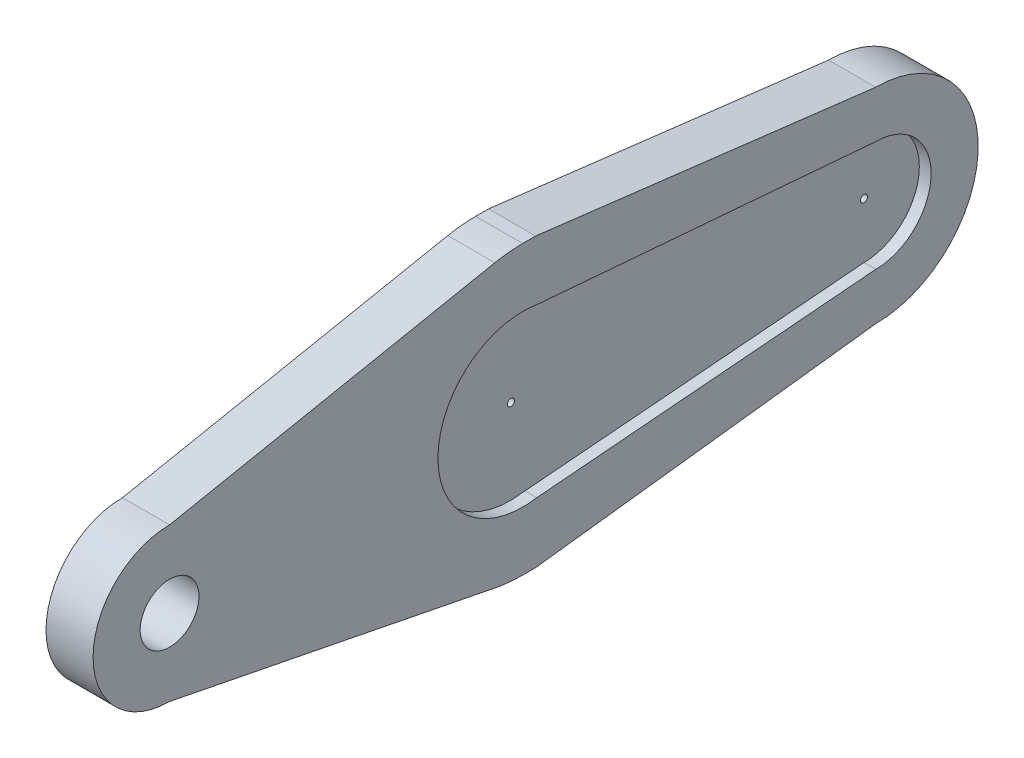
ISO-10303-21;
HEADER;
FILE_DESCRIPTION(('STEP AP214'),'2;1');
FILE_NAME('part.step','',(''),(''),'','','');
FILE_SCHEMA(('AUTOMOTIVE_DESIGN { 1 0 10303 214 1 1 1 1 }'));
ENDSEC;
DATA;
#1=APPLICATION_CONTEXT('core data for automotive mechanical design processes');
#2=APPLICATION_PROTOCOL_DEFINITION('international standard','automotive_design',2000,#1);
#3=PRODUCT_CONTEXT('',#1,'mechanical');
#4=PRODUCT('Part','Part','',(#3));
#5=PRODUCT_RELATED_PRODUCT_CATEGORY('part','',(#4));
#6=PRODUCT_DEFINITION_FORMATION('','',#4);
#7=PRODUCT_DEFINITION_CONTEXT('part definition',#1,'design');
#8=PRODUCT_DEFINITION('design','',#6,#7);
#9=PRODUCT_DEFINITION_SHAPE('','',#8);
#10=(LENGTH_UNIT() NAMED_UNIT(*) SI_UNIT(.MILLI.,.METRE.));
#11=(NAMED_UNIT(*) PLANE_ANGLE_UNIT() SI_UNIT($,.RADIAN.));
#12=(NAMED_UNIT(*) SI_UNIT($,.STERADIAN.) SOLID_ANGLE_UNIT());
#13=UNCERTAINTY_MEASURE_WITH_UNIT(LENGTH_MEASURE(1.E-05),#10,'distance_accuracy_value','');
#14=(GEOMETRIC_REPRESENTATION_CONTEXT(3) GLOBAL_UNCERTAINTY_ASSIGNED_CONTEXT((#13)) GLOBAL_UNIT_ASSIGNED_CONTEXT((#10,
#11,#12)) REPRESENTATION_CONTEXT('',''));
#15=CARTESIAN_POINT('',(0.,0.,0.));
#16=DIRECTION('',(0.,0.,1.));
#17=DIRECTION('',(1.,0.,0.));
#18=AXIS2_PLACEMENT_3D('',#15,#16,#17);
#19=CARTESIAN_POINT('',(2.,0.,0.549999999999999));
#20=DIRECTION('',(-1.,0.,0.));
#21=DIRECTION('',(0.,0.,1.));
#22=AXIS2_PLACEMENT_3D('',#19,#20,#21);
#23=CYLINDRICAL_SURFACE('',#22,3.6);
#24=CARTESIAN_POINT('',(0.,0.,0.549999999999999));
#25=DIRECTION('',(1.,0.,0.));
#26=DIRECTION('',(0.,0.,-1.));
#27=AXIS2_PLACEMENT_3D('',#24,#25,#26);
#28=CIRCLE('',#27,3.6);
#29=CARTESIAN_POINT('',(0.,-3.6,0.549999999999999));
#30=VERTEX_POINT('',#29);
#31=CARTESIAN_POINT('',(0.,-3.55034482758621,-0.0458620689654945));
#32=VERTEX_POINT('',#31);
#33=EDGE_CURVE('E193',#30,#32,#28,.T.);
#34=ORIENTED_EDGE('',*,*,#33,.F.);
#35=DIRECTION('',(-1.,0.,0.));
#36=VECTOR('',#35,1.);
#37=CARTESIAN_POINT('',(1.5,-3.6,0.549999999999999));
#38=LINE('',#37,#36);
#39=CARTESIAN_POINT('',(1.5,-3.6,0.549999999999999));
#40=VERTEX_POINT('',#39);
#41=EDGE_CURVE('E328',#40,#30,#38,.T.);
#42=ORIENTED_EDGE('',*,*,#41,.F.);
#43=CARTESIAN_POINT('',(1.5,0.,0.549999999999999));
#44=DIRECTION('',(1.,0.,0.));
#45=DIRECTION('',(0.,0.,-1.));
#46=AXIS2_PLACEMENT_3D('',#43,#44,#45);
#47=CIRCLE('',#46,3.6);
#48=CARTESIAN_POINT('',(1.5,3.6,0.549999999999999));
#49=VERTEX_POINT('',#48);
#50=EDGE_CURVE('E309',#49,#40,#47,.T.);
#51=ORIENTED_EDGE('',*,*,#50,.F.);
#52=DIRECTION('',(-1.,0.,0.));
#53=VECTOR('',#52,1.);
#54=CARTESIAN_POINT('',(1.5,3.6,0.549999999999999));
#55=LINE('',#54,#53);
#56=CARTESIAN_POINT('',(0.,3.6,0.549999999999999));
#57=VERTEX_POINT('',#56);
#58=EDGE_CURVE('E336',#49,#57,#55,.T.);
#59=ORIENTED_EDGE('',*,*,#58,.T.);
#60=CARTESIAN_POINT('',(0.,3.55034482758621,-0.0458620689654861));
#61=VERTEX_POINT('',#60);
#62=EDGE_CURVE('E195',#61,#57,#28,.T.);
#63=ORIENTED_EDGE('',*,*,#62,.F.);
#64=DIRECTION('',(-1.,0.,0.));
#65=VECTOR('',#64,1.);
#66=CARTESIAN_POINT('',(2.,3.55034482758621,-0.0458620689655113));
#67=LINE('',#66,#65);
#68=CARTESIAN_POINT('',(1.5,3.55034482758621,-0.0458620689654861));
#69=VERTEX_POINT('',#68);
#70=EDGE_CURVE('E305',#61,#69,#67,.F.);
#71=ORIENTED_EDGE('',*,*,#70,.T.);
#72=DIRECTION('',(-1.,0.,0.));
#73=VECTOR('',#72,1.);
#74=CARTESIAN_POINT('',(2.,3.55034482758621,-0.0458620689654861));
#75=LINE('',#74,#73);
#76=CARTESIAN_POINT('',(2.,3.55034482758621,-0.0458620689654861));
#77=VERTEX_POINT('',#76);
#78=EDGE_CURVE('E259',#77,#69,#75,.T.);
#79=ORIENTED_EDGE('',*,*,#78,.F.);
#80=CARTESIAN_POINT('',(2.,0.,0.549999999999999));
#81=DIRECTION('',(1.,0.,0.));
#82=DIRECTION('',(0.,0.,-1.));
#83=AXIS2_PLACEMENT_3D('',#80,#81,#82);
#84=CIRCLE('',#83,3.6);
#85=CARTESIAN_POINT('',(2.,-3.55034482758621,-0.0458620689654945));
#86=VERTEX_POINT('',#85);
#87=EDGE_CURVE('E351',#77,#86,#84,.T.);
#88=ORIENTED_EDGE('',*,*,#87,.T.);
#89=DIRECTION('',(-1.,0.,0.));
#90=VECTOR('',#89,1.);
#91=CARTESIAN_POINT('',(2.,-3.55034482758621,-0.0458620689654945));
#92=LINE('',#91,#90);
#93=CARTESIAN_POINT('',(1.5,-3.55034482758621,-0.0458620689654945));
#94=VERTEX_POINT('',#93);
#95=EDGE_CURVE('E262',#86,#94,#92,.T.);
#96=ORIENTED_EDGE('',*,*,#95,.T.);
#97=DIRECTION('',(-1.,0.,0.));
#98=VECTOR('',#97,1.);
#99=CARTESIAN_POINT('',(2.,-3.55034482758621,-0.0458620689655113));
#100=LINE('',#99,#98);
#101=EDGE_CURVE('E194',#94,#32,#100,.T.);
#102=ORIENTED_EDGE('',*,*,#101,.T.);
#103=EDGE_LOOP('',(#34,#42,#51,#59,#63,#71,#79,#88,#96,#102));
#104=FACE_BOUND('',#103,.T.);
#105=ADVANCED_FACE('F47',(#104),#23,.F.);
#106=CARTESIAN_POINT('',(2.,6.1,0.));
#107=DIRECTION('',(0.,-1.,0.));
#108=DIRECTION('',(0.,0.,-1.));
#109=AXIS2_PLACEMENT_3D('',#106,#107,#108);
#110=PLANE('',#109);
#111=DIRECTION('',(0.,0.,1.));
#112=VECTOR('',#111,1.);
#113=CARTESIAN_POINT('',(0.,6.1,0.));
#114=LINE('',#113,#112);
#115=CARTESIAN_POINT('',(0.,6.1,0.));
#116=VERTEX_POINT('',#115);
#117=CARTESIAN_POINT('',(0.,6.1,0.549999999999999));
#118=VERTEX_POINT('',#117);
#119=EDGE_CURVE('E199',#116,#118,#114,.T.);
#120=ORIENTED_EDGE('',*,*,#119,.T.);
#121=DIRECTION('',(-1.,0.,0.));
#122=VECTOR('',#121,1.);
#123=CARTESIAN_POINT('',(2.,6.1,0.549999999999999));
#124=LINE('',#123,#122);
#125=CARTESIAN_POINT('',(2.,6.1,0.549999999999999));
#126=VERTEX_POINT('',#125);
#127=EDGE_CURVE('E11',#126,#118,#124,.T.);
#128=ORIENTED_EDGE('',*,*,#127,.F.);
#129=DIRECTION('',(0.,0.,1.));
#130=VECTOR('',#129,1.);
#131=CARTESIAN_POINT('',(2.,6.1,0.));
#132=LINE('',#131,#130);
#133=CARTESIAN_POINT('',(2.,6.1,0.));
#134=VERTEX_POINT('',#133);
#135=EDGE_CURVE('E358',#134,#126,#132,.T.);
#136=ORIENTED_EDGE('',*,*,#135,.F.);
#137=DIRECTION('',(-1.,0.,0.));
#138=VECTOR('',#137,1.);
#139=CARTESIAN_POINT('',(2.,6.1,0.));
#140=LINE('',#139,#138);
#141=EDGE_CURVE('E231',#134,#116,#140,.T.);
#142=ORIENTED_EDGE('',*,*,#141,.T.);
#143=EDGE_LOOP('',(#120,#128,#136,#142));
#144=FACE_BOUND('',#143,.T.);
#145=ADVANCED_FACE('F388',(#144),#110,.F.);
#146=CARTESIAN_POINT('',(2.,0.,0.549999999999999));
#147=DIRECTION('',(-1.,0.,0.));
#148=DIRECTION('',(0.,0.,1.));
#149=AXIS2_PLACEMENT_3D('',#146,#147,#148);
#150=CYLINDRICAL_SURFACE('',#149,6.1);
#151=CARTESIAN_POINT('',(0.,0.,0.549999999999999));
#152=DIRECTION('',(1.,0.,0.));
#153=DIRECTION('',(0.,0.,-1.));
#154=AXIS2_PLACEMENT_3D('',#151,#152,#153);
#155=CIRCLE('',#154,6.1);
#156=CARTESIAN_POINT('',(0.,5.98396265759772,1.73414142418716));
#157=VERTEX_POINT('',#156);
#158=EDGE_CURVE('E203',#118,#157,#155,.T.);
#159=ORIENTED_EDGE('',*,*,#158,.T.);
#160=DIRECTION('',(-1.,0.,0.));
#161=VECTOR('',#160,1.);
#162=CARTESIAN_POINT('',(2.,5.98396265759772,1.73414142418716));
#163=LINE('',#162,#161);
#164=CARTESIAN_POINT('',(2.,5.98396265759772,1.73414142418716));
#165=VERTEX_POINT('',#164);
#166=EDGE_CURVE('E57',#165,#157,#163,.T.);
#167=ORIENTED_EDGE('',*,*,#166,.F.);
#168=CARTESIAN_POINT('',(2.,0.,0.549999999999999));
#169=DIRECTION('',(1.,0.,0.));
#170=DIRECTION('',(0.,0.,-1.));
#171=AXIS2_PLACEMENT_3D('',#168,#169,#170);
#172=CIRCLE('',#171,6.1);
#173=EDGE_CURVE('E361',#126,#165,#172,.T.);
#174=ORIENTED_EDGE('',*,*,#173,.F.);
#175=ORIENTED_EDGE('',*,*,#127,.T.);
#176=EDGE_LOOP('',(#159,#167,#174,#175));
#177=FACE_BOUND('',#176,.T.);
#178=ADVANCED_FACE('F393',(#177),#150,.T.);
#179=CARTESIAN_POINT('',(2.,6.08869853330339,1.20486717000446));
#180=DIRECTION('',(0.,-0.980977484852086,-0.194121544948715));
#181=DIRECTION('',(0.,0.194121544948715,-0.980977484852086));
#182=AXIS2_PLACEMENT_3D('',#179,#180,#181);
#183=PLANE('',#182);
#184=DIRECTION('',(0.,-0.194121544948715,0.980977484852086));
#185=VECTOR('',#184,1.);
#186=CARTESIAN_POINT('',(0.,6.08869853330339,1.20486717000446));
#187=LINE('',#186,#185);
#188=CARTESIAN_POINT('',(0.,3.25,15.55));
#189=VERTEX_POINT('',#188);
#190=EDGE_CURVE('E206',#157,#189,#187,.T.);
#191=ORIENTED_EDGE('',*,*,#190,.T.);
#192=DIRECTION('',(-1.,0.,0.));
#193=VECTOR('',#192,1.);
#194=CARTESIAN_POINT('',(2.,3.25,15.55));
#195=LINE('',#194,#193);
#196=CARTESIAN_POINT('',(2.,3.25,15.55));
#197=VERTEX_POINT('',#196);
#198=EDGE_CURVE('E249',#197,#189,#195,.T.);
#199=ORIENTED_EDGE('',*,*,#198,.F.);
#200=DIRECTION('',(0.,-0.194121544948715,0.980977484852086));
#201=VECTOR('',#200,1.);
#202=CARTESIAN_POINT('',(2.,6.08869853330339,1.20486717000446));
#203=LINE('',#202,#201);
#204=EDGE_CURVE('E364',#165,#197,#203,.T.);
#205=ORIENTED_EDGE('',*,*,#204,.F.);
#206=ORIENTED_EDGE('',*,*,#166,.T.);
#207=EDGE_LOOP('',(#191,#199,#205,#206));
#208=FACE_BOUND('',#207,.T.);
#209=ADVANCED_FACE('F396',(#208),#183,.F.);
#210=CARTESIAN_POINT('',(2.,0.,15.55));
#211=DIRECTION('',(-1.,0.,0.));
#212=DIRECTION('',(0.,0.,1.));
#213=AXIS2_PLACEMENT_3D('',#210,#211,#212);
#214=CYLINDRICAL_SURFACE('',#213,3.25);
#215=CARTESIAN_POINT('',(0.,0.,15.55));
#216=DIRECTION('',(1.,0.,0.));
#217=DIRECTION('',(0.,0.,-1.));
#218=AXIS2_PLACEMENT_3D('',#215,#216,#217);
#219=CIRCLE('',#218,3.25);
#220=CARTESIAN_POINT('',(0.,-3.25,15.55));
#221=VERTEX_POINT('',#220);
#222=EDGE_CURVE('E209',#189,#221,#219,.T.);
#223=ORIENTED_EDGE('',*,*,#222,.T.);
#224=DIRECTION('',(-1.,0.,0.));
#225=VECTOR('',#224,1.);
#226=CARTESIAN_POINT('',(2.,-3.25,15.55));
#227=LINE('',#226,#225);
#228=CARTESIAN_POINT('',(2.,-3.25,15.55));
#229=VERTEX_POINT('',#228);
#230=EDGE_CURVE('E245',#229,#221,#227,.T.);
#231=ORIENTED_EDGE('',*,*,#230,.F.);
#232=CARTESIAN_POINT('',(2.,0.,15.55));
#233=DIRECTION('',(1.,0.,0.));
#234=DIRECTION('',(0.,0.,-1.));
#235=AXIS2_PLACEMENT_3D('',#232,#233,#234);
#236=CIRCLE('',#235,3.25);
#237=EDGE_CURVE('E367',#197,#229,#236,.T.);
#238=ORIENTED_EDGE('',*,*,#237,.F.);
#239=ORIENTED_EDGE('',*,*,#198,.T.);
#240=EDGE_LOOP('',(#223,#231,#238,#239));
#241=FACE_BOUND('',#240,.T.);
#242=ADVANCED_FACE('F401',(#241),#214,.T.);
#243=CARTESIAN_POINT('',(2.,-6.08869853330339,1.20486717000446));
#244=DIRECTION('',(0.,0.980977484852086,-0.194121544948715));
#245=DIRECTION('',(0.,0.194121544948715,0.980977484852086));
#246=AXIS2_PLACEMENT_3D('',#243,#244,#245);
#247=PLANE('',#246);
#248=DIRECTION('',(0.,-0.194121544948715,-0.980977484852086));
#249=VECTOR('',#248,1.);
#250=CARTESIAN_POINT('',(0.,-6.08869853330339,1.20486717000446));
#251=LINE('',#250,#249);
#252=CARTESIAN_POINT('',(0.,-5.98396265759773,1.73414142418716));
#253=VERTEX_POINT('',#252);
#254=EDGE_CURVE('E212',#221,#253,#251,.T.);
#255=ORIENTED_EDGE('',*,*,#254,.T.);
#256=DIRECTION('',(-1.,0.,0.));
#257=VECTOR('',#256,1.);
#258=CARTESIAN_POINT('',(2.,-5.98396265759773,1.73414142418716));
#259=LINE('',#258,#257);
#260=CARTESIAN_POINT('',(2.,-5.98396265759773,1.73414142418716));
#261=VERTEX_POINT('',#260);
#262=EDGE_CURVE('E241',#261,#253,#259,.T.);
#263=ORIENTED_EDGE('',*,*,#262,.F.);
#264=DIRECTION('',(0.,-0.194121544948715,-0.980977484852086));
#265=VECTOR('',#264,1.);
#266=CARTESIAN_POINT('',(2.,-6.08869853330339,1.20486717000446));
#267=LINE('',#266,#265);
#268=EDGE_CURVE('E370',#229,#261,#267,.T.);
#269=ORIENTED_EDGE('',*,*,#268,.F.);
#270=ORIENTED_EDGE('',*,*,#230,.T.);
#271=EDGE_LOOP('',(#255,#263,#269,#270));
#272=FACE_BOUND('',#271,.T.);
#273=ADVANCED_FACE('F406',(#272),#247,.F.);
#274=CARTESIAN_POINT('',(2.,0.,0.549999999999999));
#275=DIRECTION('',(-1.,0.,0.));
#276=DIRECTION('',(0.,0.,1.));
#277=AXIS2_PLACEMENT_3D('',#274,#275,#276);
#278=CYLINDRICAL_SURFACE('',#277,6.1);
#279=CARTESIAN_POINT('',(0.,0.,0.549999999999999));
#280=DIRECTION('',(1.,0.,0.));
#281=DIRECTION('',(0.,0.,-1.));
#282=AXIS2_PLACEMENT_3D('',#279,#280,#281);
#283=CIRCLE('',#282,6.1);
#284=CARTESIAN_POINT('',(0.,-6.1,0.549999999999999));
#285=VERTEX_POINT('',#284);
#286=EDGE_CURVE('E215',#253,#285,#283,.T.);
#287=ORIENTED_EDGE('',*,*,#286,.T.);
#288=DIRECTION('',(-1.,0.,0.));
#289=VECTOR('',#288,1.);
#290=CARTESIAN_POINT('',(2.,-6.1,0.549999999999999));
#291=LINE('',#290,#289);
#292=CARTESIAN_POINT('',(2.,-6.1,0.549999999999999));
#293=VERTEX_POINT('',#292);
#294=EDGE_CURVE('E238',#293,#285,#291,.T.);
#295=ORIENTED_EDGE('',*,*,#294,.F.);
#296=CARTESIAN_POINT('',(2.,0.,0.549999999999999));
#297=DIRECTION('',(1.,0.,0.));
#298=DIRECTION('',(0.,0.,-1.));
#299=AXIS2_PLACEMENT_3D('',#296,#297,#298);
#300=CIRCLE('',#299,6.1);
#301=EDGE_CURVE('E373',#261,#293,#300,.T.);
#302=ORIENTED_EDGE('',*,*,#301,.F.);
#303=ORIENTED_EDGE('',*,*,#262,.T.);
#304=EDGE_LOOP('',(#287,#295,#302,#303));
#305=FACE_BOUND('',#304,.T.);
#306=ADVANCED_FACE('F409',(#305),#278,.T.);
#307=CARTESIAN_POINT('',(2.,-6.1,0.));
#308=DIRECTION('',(0.,-1.,0.));
#309=DIRECTION('',(0.,0.,-1.));
#310=AXIS2_PLACEMENT_3D('',#307,#308,#309);
#311=PLANE('',#310);
#312=DIRECTION('',(0.,0.,1.));
#313=VECTOR('',#312,1.);
#314=CARTESIAN_POINT('',(0.,-6.1,0.));
#315=LINE('',#314,#313);
#316=CARTESIAN_POINT('',(0.,-6.1,0.));
#317=VERTEX_POINT('',#316);
#318=EDGE_CURVE('E219',#317,#285,#315,.T.);
#319=ORIENTED_EDGE('',*,*,#318,.F.);
#320=DIRECTION('',(-1.,0.,0.));
#321=VECTOR('',#320,1.);
#322=CARTESIAN_POINT('',(2.,-6.1,0.));
#323=LINE('',#322,#321);
#324=CARTESIAN_POINT('',(2.,-6.1,0.));
#325=VERTEX_POINT('',#324);
#326=EDGE_CURVE('E178',#325,#317,#323,.T.);
#327=ORIENTED_EDGE('',*,*,#326,.F.);
#328=DIRECTION('',(0.,0.,1.));
#329=VECTOR('',#328,1.);
#330=CARTESIAN_POINT('',(2.,-6.1,0.));
#331=LINE('',#330,#329);
#332=EDGE_CURVE('E166',#325,#293,#331,.T.);
#333=ORIENTED_EDGE('',*,*,#332,.T.);
#334=ORIENTED_EDGE('',*,*,#294,.T.);
#335=EDGE_LOOP('',(#319,#327,#333,#334));
#336=FACE_BOUND('',#335,.T.);
#337=ADVANCED_FACE('F378',(#336),#311,.T.);
#338=CARTESIAN_POINT('',(2.,-6.01182474689071,-0.728075661388148));
#339=DIRECTION('',(0.,0.992746211513238,0.12022877994105));
#340=DIRECTION('',(0.,-0.12022877994105,0.992746211513238));
#341=AXIS2_PLACEMENT_3D('',#338,#339,#340);
#342=PLANE('',#341);
#343=DIRECTION('',(0.,0.12022877994105,-0.992746211513238));
#344=VECTOR('',#343,1.);
#345=CARTESIAN_POINT('',(0.,-6.01182474689071,-0.728075661388148));
#346=LINE('',#345,#344);
#347=CARTESIAN_POINT('',(0.,-4.35,-14.45));
#348=VERTEX_POINT('',#347);
#349=EDGE_CURVE('E174',#317,#348,#346,.T.);
#350=ORIENTED_EDGE('',*,*,#349,.T.);
#351=DIRECTION('',(-1.,0.,0.));
#352=VECTOR('',#351,1.);
#353=CARTESIAN_POINT('',(2.,-4.35,-14.45));
#354=LINE('',#353,#352);
#355=CARTESIAN_POINT('',(2.,-4.35,-14.45));
#356=VERTEX_POINT('',#355);
#357=EDGE_CURVE('E171',#356,#348,#354,.T.);
#358=ORIENTED_EDGE('',*,*,#357,.F.);
#359=DIRECTION('',(0.,0.12022877994105,-0.992746211513238));
#360=VECTOR('',#359,1.);
#361=CARTESIAN_POINT('',(2.,-6.01182474689071,-0.728075661388148));
#362=LINE('',#361,#360);
#363=EDGE_CURVE('E159',#325,#356,#362,.T.);
#364=ORIENTED_EDGE('',*,*,#363,.F.);
#365=ORIENTED_EDGE('',*,*,#326,.T.);
#366=EDGE_LOOP('',(#350,#358,#364,#365));
#367=FACE_BOUND('',#366,.T.);
#368=ADVANCED_FACE('F172',(#367),#342,.F.);
#369=CARTESIAN_POINT('',(2.,0.,-14.45));
#370=DIRECTION('',(-1.,0.,0.));
#371=DIRECTION('',(0.,0.,1.));
#372=AXIS2_PLACEMENT_3D('',#369,#370,#371);
#373=CYLINDRICAL_SURFACE('',#372,4.35);
#374=CARTESIAN_POINT('',(0.,0.,-14.45));
#375=DIRECTION('',(1.,0.,0.));
#376=DIRECTION('',(0.,0.,-1.));
#377=AXIS2_PLACEMENT_3D('',#374,#375,#376);
#378=CIRCLE('',#377,4.35);
#379=CARTESIAN_POINT('',(0.,4.35,-14.45));
#380=VERTEX_POINT('',#379);
#381=EDGE_CURVE('E225',#348,#380,#378,.T.);
#382=ORIENTED_EDGE('',*,*,#381,.T.);
#383=DIRECTION('',(-1.,0.,0.));
#384=VECTOR('',#383,1.);
#385=CARTESIAN_POINT('',(2.,4.35,-14.45));
#386=LINE('',#385,#384);
#387=CARTESIAN_POINT('',(2.,4.35,-14.45));
#388=VERTEX_POINT('',#387);
#389=EDGE_CURVE('E179',#388,#380,#386,.T.);
#390=ORIENTED_EDGE('',*,*,#389,.F.);
#391=CARTESIAN_POINT('',(2.,0.,-14.45));
#392=DIRECTION('',(1.,0.,0.));
#393=DIRECTION('',(0.,0.,-1.));
#394=AXIS2_PLACEMENT_3D('',#391,#392,#393);
#395=CIRCLE('',#394,4.35);
#396=EDGE_CURVE('E163',#356,#388,#395,.T.);
#397=ORIENTED_EDGE('',*,*,#396,.F.);
#398=ORIENTED_EDGE('',*,*,#357,.T.);
#399=EDGE_LOOP('',(#382,#390,#397,#398));
#400=FACE_BOUND('',#399,.T.);
#401=ADVANCED_FACE('F181',(#400),#373,.T.);
#402=CARTESIAN_POINT('',(2.,0.,-14.45));
#403=DIRECTION('',(-1.,0.,0.));
#404=DIRECTION('',(0.,0.,1.));
#405=AXIS2_PLACEMENT_3D('',#402,#403,#404);
#406=CYLINDRICAL_SURFACE('',#405,2.35);
#407=CARTESIAN_POINT('',(1.5,0.,-14.45));
#408=DIRECTION('',(1.,0.,0.));
#409=DIRECTION('',(0.,0.,-1.));
#410=AXIS2_PLACEMENT_3D('',#407,#408,#409);
#411=CIRCLE('',#410,2.35);
#412=CARTESIAN_POINT('',(1.5,-2.35,-14.45));
#413=VERTEX_POINT('',#412);
#414=CARTESIAN_POINT('',(1.5,2.35,-14.45));
#415=VERTEX_POINT('',#414);
#416=EDGE_CURVE('E311',#413,#415,#411,.T.);
#417=ORIENTED_EDGE('',*,*,#416,.F.);
#418=DIRECTION('',(-1.,0.,0.));
#419=VECTOR('',#418,1.);
#420=CARTESIAN_POINT('',(2.,-2.35,-14.45));
#421=LINE('',#420,#419);
#422=CARTESIAN_POINT('',(2.,-2.35,-14.45));
#423=VERTEX_POINT('',#422);
#424=EDGE_CURVE('E51',#423,#413,#421,.T.);
#425=ORIENTED_EDGE('',*,*,#424,.F.);
#426=CARTESIAN_POINT('',(2.,0.,-14.45));
#427=DIRECTION('',(1.,0.,0.));
#428=DIRECTION('',(0.,0.,-1.));
#429=AXIS2_PLACEMENT_3D('',#426,#427,#428);
#430=CIRCLE('',#429,2.35);
#431=CARTESIAN_POINT('',(2.,2.35,-14.45));
#432=VERTEX_POINT('',#431);
#433=EDGE_CURVE('E346',#423,#432,#430,.T.);
#434=ORIENTED_EDGE('',*,*,#433,.T.);
#435=DIRECTION('',(-1.,0.,0.));
#436=VECTOR('',#435,1.);
#437=CARTESIAN_POINT('',(2.,2.35,-14.45));
#438=LINE('',#437,#436);
#439=EDGE_CURVE('E185',#432,#415,#438,.T.);
#440=ORIENTED_EDGE('',*,*,#439,.T.);
#441=EDGE_LOOP('',(#417,#425,#434,#440));
#442=FACE_BOUND('',#441,.T.);
#443=ADVANCED_FACE('F430',(#442),#406,.F.);
#444=CARTESIAN_POINT('',(2.,-3.52965517241379,-0.294137931034483));
#445=DIRECTION('',(0.,0.99654575824488,0.0830454798537399));
#446=DIRECTION('',(0.,-0.08304547985374,0.99654575824488));
#447=AXIS2_PLACEMENT_3D('',#444,#445,#446);
#448=PLANE('',#447);
#449=DIRECTION('',(0.,0.08304547985374,-0.99654575824488));
#450=VECTOR('',#449,1.);
#451=CARTESIAN_POINT('',(1.5,-3.52965517241379,-0.294137931034483));
#452=LINE('',#451,#450);
#453=EDGE_CURVE('E275',#94,#413,#452,.T.);
#454=ORIENTED_EDGE('',*,*,#453,.F.);
#455=ORIENTED_EDGE('',*,*,#95,.F.);
#456=DIRECTION('',(0.,0.08304547985374,-0.99654575824488));
#457=VECTOR('',#456,1.);
#458=CARTESIAN_POINT('',(2.,-3.52965517241379,-0.294137931034483));
#459=LINE('',#458,#457);
#460=EDGE_CURVE('E277',#86,#423,#459,.T.);
#461=ORIENTED_EDGE('',*,*,#460,.T.);
#462=ORIENTED_EDGE('',*,*,#424,.T.);
#463=EDGE_LOOP('',(#454,#455,#461,#462));
#464=FACE_BOUND('',#463,.T.);
#465=ADVANCED_FACE('F273',(#464),#448,.T.);
#466=CARTESIAN_POINT('',(2.,3.52965517241379,-0.294137931034483));
#467=DIRECTION('',(0.,-0.99654575824488,0.0830454798537399));
#468=DIRECTION('',(0.,-0.08304547985374,-0.99654575824488));
#469=AXIS2_PLACEMENT_3D('',#466,#467,#468);
#470=PLANE('',#469);
#471=DIRECTION('',(0.,0.08304547985374,0.99654575824488));
#472=VECTOR('',#471,1.);
#473=CARTESIAN_POINT('',(1.5,3.52965517241379,-0.294137931034483));
#474=LINE('',#473,#472);
#475=EDGE_CURVE('E322',#415,#69,#474,.T.);
#476=ORIENTED_EDGE('',*,*,#475,.F.);
#477=ORIENTED_EDGE('',*,*,#439,.F.);
#478=DIRECTION('',(0.,0.08304547985374,0.99654575824488));
#479=VECTOR('',#478,1.);
#480=CARTESIAN_POINT('',(2.,3.52965517241379,-0.294137931034483));
#481=LINE('',#480,#479);
#482=EDGE_CURVE('E354',#432,#77,#481,.T.);
#483=ORIENTED_EDGE('',*,*,#482,.T.);
#484=ORIENTED_EDGE('',*,*,#78,.T.);
#485=EDGE_LOOP('',(#476,#477,#483,#484));
#486=FACE_BOUND('',#485,.T.);
#487=ADVANCED_FACE('F428',(#486),#470,.T.);
#488=CARTESIAN_POINT('',(2.,0.,15.55));
#489=DIRECTION('',(-1.,0.,0.));
#490=DIRECTION('',(0.,0.,1.));
#491=AXIS2_PLACEMENT_3D('',#488,#489,#490);
#492=CYLINDRICAL_SURFACE('',#491,1.25);
#493=CARTESIAN_POINT('',(2.,0.,15.55));
#494=DIRECTION('',(1.,0.,0.));
#495=DIRECTION('',(0.,0.,-1.));
#496=AXIS2_PLACEMENT_3D('',#493,#494,#495);
#497=CIRCLE('',#496,1.25);
#498=CARTESIAN_POINT('',(2.,0.,14.3));
#499=VERTEX_POINT('',#498);
#500=EDGE_CURVE('E230',#499,#499,#497,.T.);
#501=ORIENTED_EDGE('',*,*,#500,.T.);
#502=EDGE_LOOP('',(#501));
#503=FACE_BOUND('',#502,.T.);
#504=CARTESIAN_POINT('',(0.,0.,15.55));
#505=DIRECTION('',(1.,0.,0.));
#506=DIRECTION('',(0.,0.,-1.));
#507=AXIS2_PLACEMENT_3D('',#504,#505,#506);
#508=CIRCLE('',#507,1.25);
#509=CARTESIAN_POINT('',(0.,0.,14.3));
#510=VERTEX_POINT('',#509);
#511=EDGE_CURVE('E189',#510,#510,#508,.T.);
#512=ORIENTED_EDGE('',*,*,#511,.F.);
#513=EDGE_LOOP('',(#512));
#514=FACE_BOUND('',#513,.T.);
#515=ADVANCED_FACE('F49',(#503,#514),#492,.F.);
#516=CARTESIAN_POINT('',(2.,6.01182474689071,-0.728075661388148));
#517=DIRECTION('',(0.,-0.992746211513238,0.12022877994105));
#518=DIRECTION('',(0.,-0.12022877994105,-0.992746211513238));
#519=AXIS2_PLACEMENT_3D('',#516,#517,#518);
#520=PLANE('',#519);
#521=DIRECTION('',(0.,0.12022877994105,0.992746211513238));
#522=VECTOR('',#521,1.);
#523=CARTESIAN_POINT('',(0.,6.01182474689071,-0.728075661388148));
#524=LINE('',#523,#522);
#525=EDGE_CURVE('E115',#380,#116,#524,.T.);
#526=ORIENTED_EDGE('',*,*,#525,.T.);
#527=ORIENTED_EDGE('',*,*,#141,.F.);
#528=DIRECTION('',(0.,0.12022877994105,0.992746211513238));
#529=VECTOR('',#528,1.);
#530=CARTESIAN_POINT('',(2.,6.01182474689071,-0.728075661388148));
#531=LINE('',#530,#529);
#532=EDGE_CURVE('E73',#388,#134,#531,.T.);
#533=ORIENTED_EDGE('',*,*,#532,.F.);
#534=ORIENTED_EDGE('',*,*,#389,.T.);
#535=EDGE_LOOP('',(#526,#527,#533,#534));
#536=FACE_BOUND('',#535,.T.);
#537=ADVANCED_FACE('F384',(#536),#520,.F.);
#538=CARTESIAN_POINT('',(2.,0.,0.));
#539=DIRECTION('',(1.,0.,0.));
#540=DIRECTION('',(0.,0.,-1.));
#541=AXIS2_PLACEMENT_3D('',#538,#539,#540);
#542=PLANE('',#541);
#543=ORIENTED_EDGE('',*,*,#500,.F.);
#544=EDGE_LOOP('',(#543));
#545=FACE_BOUND('',#544,.T.);
#546=ORIENTED_EDGE('',*,*,#433,.F.);
#547=ORIENTED_EDGE('',*,*,#460,.F.);
#548=ORIENTED_EDGE('',*,*,#87,.F.);
#549=ORIENTED_EDGE('',*,*,#482,.F.);
#550=EDGE_LOOP('',(#546,#547,#548,#549));
#551=FACE_BOUND('',#550,.T.);
#552=ORIENTED_EDGE('',*,*,#135,.T.);
#553=ORIENTED_EDGE('',*,*,#173,.T.);
#554=ORIENTED_EDGE('',*,*,#204,.T.);
#555=ORIENTED_EDGE('',*,*,#237,.T.);
#556=ORIENTED_EDGE('',*,*,#268,.T.);
#557=ORIENTED_EDGE('',*,*,#301,.T.);
#558=ORIENTED_EDGE('',*,*,#332,.F.);
#559=ORIENTED_EDGE('',*,*,#363,.T.);
#560=ORIENTED_EDGE('',*,*,#396,.T.);
#561=ORIENTED_EDGE('',*,*,#532,.T.);
#562=EDGE_LOOP('',(#552,#553,#554,#555,#556,#557,#558,#559,#560,#561));
#563=FACE_BOUND('',#562,.T.);
#564=ADVANCED_FACE('F161',(#545,#551,#563),#542,.T.);
#565=CARTESIAN_POINT('',(0.,0.,0.));
#566=DIRECTION('',(1.,0.,0.));
#567=DIRECTION('',(0.,0.,-1.));
#568=AXIS2_PLACEMENT_3D('',#565,#566,#567);
#569=PLANE('',#568);
#570=DIRECTION('',(0.,0.08304547985374,0.99654575824488));
#571=VECTOR('',#570,1.);
#572=CARTESIAN_POINT('',(0.,3.52965517241379,-0.294137931034483));
#573=LINE('',#572,#571);
#574=EDGE_CURVE('E317',#61,#57,#573,.T.);
#575=ORIENTED_EDGE('',*,*,#574,.F.);
#576=ORIENTED_EDGE('',*,*,#62,.T.);
#577=EDGE_LOOP('',(#575,#576));
#578=FACE_BOUND('',#577,.T.);
#579=ORIENTED_EDGE('',*,*,#511,.T.);
#580=EDGE_LOOP('',(#579));
#581=FACE_BOUND('',#580,.T.);
#582=ORIENTED_EDGE('',*,*,#33,.T.);
#583=DIRECTION('',(0.,0.08304547985374,-0.99654575824488));
#584=VECTOR('',#583,1.);
#585=CARTESIAN_POINT('',(0.,-3.52965517241379,-0.294137931034483));
#586=LINE('',#585,#584);
#587=EDGE_CURVE('E64',#30,#32,#586,.T.);
#588=ORIENTED_EDGE('',*,*,#587,.F.);
#589=EDGE_LOOP('',(#582,#588));
#590=FACE_BOUND('',#589,.T.);
#591=ORIENTED_EDGE('',*,*,#119,.F.);
#592=ORIENTED_EDGE('',*,*,#525,.F.);
#593=ORIENTED_EDGE('',*,*,#381,.F.);
#594=ORIENTED_EDGE('',*,*,#349,.F.);
#595=ORIENTED_EDGE('',*,*,#318,.T.);
#596=ORIENTED_EDGE('',*,*,#286,.F.);
#597=ORIENTED_EDGE('',*,*,#254,.F.);
#598=ORIENTED_EDGE('',*,*,#222,.F.);
#599=ORIENTED_EDGE('',*,*,#190,.F.);
#600=ORIENTED_EDGE('',*,*,#158,.F.);
#601=EDGE_LOOP('',(#591,#592,#593,#594,#595,#596,#597,#598,#599,#600));
#602=FACE_BOUND('',#601,.T.);
#603=ADVANCED_FACE('F382',(#578,#581,#590,#602),#569,.F.);
#604=CARTESIAN_POINT('',(1.5,-3.52965517241379,-0.294137931034483));
#605=DIRECTION('',(0.,0.996545758244879,0.08304547985374));
#606=DIRECTION('',(0.,-0.08304547985374,0.99654575824488));
#607=AXIS2_PLACEMENT_3D('',#604,#605,#606);
#608=PLANE('',#607);
#609=ORIENTED_EDGE('',*,*,#101,.F.);
#610=EDGE_CURVE('E301',#40,#94,#452,.T.);
#611=ORIENTED_EDGE('',*,*,#610,.F.);
#612=ORIENTED_EDGE('',*,*,#41,.T.);
#613=ORIENTED_EDGE('',*,*,#587,.T.);
#614=EDGE_LOOP('',(#609,#611,#612,#613));
#615=FACE_BOUND('',#614,.T.);
#616=ADVANCED_FACE('F300',(#615),#608,.F.);
#617=CARTESIAN_POINT('',(1.5,3.52965517241379,-0.294137931034483));
#618=DIRECTION('',(0.,-0.996545758244879,0.08304547985374));
#619=DIRECTION('',(0.,-0.08304547985374,-0.99654575824488));
#620=AXIS2_PLACEMENT_3D('',#617,#618,#619);
#621=PLANE('',#620);
#622=ORIENTED_EDGE('',*,*,#70,.F.);
#623=ORIENTED_EDGE('',*,*,#574,.T.);
#624=ORIENTED_EDGE('',*,*,#58,.F.);
#625=EDGE_CURVE('E315',#69,#49,#474,.T.);
#626=ORIENTED_EDGE('',*,*,#625,.F.);
#627=EDGE_LOOP('',(#622,#623,#624,#626));
#628=FACE_BOUND('',#627,.T.);
#629=ADVANCED_FACE('F503',(#628),#621,.F.);
#630=CARTESIAN_POINT('',(1.5,0.,0.));
#631=DIRECTION('',(1.,0.,0.));
#632=DIRECTION('',(0.,0.,-1.));
#633=AXIS2_PLACEMENT_3D('',#630,#631,#632);
#634=PLANE('',#633);
#635=CARTESIAN_POINT('',(1.5,0.,0.549999999999999));
#636=DIRECTION('',(1.,0.,0.));
#637=DIRECTION('',(0.,0.,-1.));
#638=AXIS2_PLACEMENT_3D('',#635,#636,#637);
#639=CIRCLE('',#638,0.15);
#640=CARTESIAN_POINT('',(1.5,0.,0.4));
#641=VERTEX_POINT('',#640);
#642=EDGE_CURVE('E630',#641,#641,#639,.T.);
#643=ORIENTED_EDGE('',*,*,#642,.F.);
#644=EDGE_LOOP('',(#643));
#645=FACE_BOUND('',#644,.T.);
#646=CARTESIAN_POINT('',(1.5,0.,-14.45));
#647=DIRECTION('',(1.,0.,0.));
#648=DIRECTION('',(0.,0.,-1.));
#649=AXIS2_PLACEMENT_3D('',#646,#647,#648);
#650=CIRCLE('',#649,0.150000000000001);
#651=CARTESIAN_POINT('',(1.5,0.,-14.6));
#652=VERTEX_POINT('',#651);
#653=EDGE_CURVE('E634',#652,#652,#650,.T.);
#654=ORIENTED_EDGE('',*,*,#653,.F.);
#655=EDGE_LOOP('',(#654));
#656=FACE_BOUND('',#655,.T.);
#657=ORIENTED_EDGE('',*,*,#610,.T.);
#658=ORIENTED_EDGE('',*,*,#453,.T.);
#659=ORIENTED_EDGE('',*,*,#416,.T.);
#660=ORIENTED_EDGE('',*,*,#475,.T.);
#661=ORIENTED_EDGE('',*,*,#625,.T.);
#662=ORIENTED_EDGE('',*,*,#50,.T.);
#663=EDGE_LOOP('',(#657,#658,#659,#660,#661,#662));
#664=FACE_BOUND('',#663,.T.);
#665=ADVANCED_FACE('F307',(#645,#656,#664),#634,.T.);
#666=CARTESIAN_POINT('',(1.,0.,-14.45));
#667=DIRECTION('',(1.,0.,0.));
#668=DIRECTION('',(0.,0.,-1.));
#669=AXIS2_PLACEMENT_3D('',#666,#667,#668);
#670=CYLINDRICAL_SURFACE('',#669,0.150000000000001);
#671=CARTESIAN_POINT('',(1.,0.,-14.45));
#672=DIRECTION('',(1.,0.,0.));
#673=DIRECTION('',(0.,0.,-1.));
#674=AXIS2_PLACEMENT_3D('',#671,#672,#673);
#675=CIRCLE('',#674,0.150000000000001);
#676=CARTESIAN_POINT('',(1.,0.,-14.6));
#677=VERTEX_POINT('',#676);
#678=EDGE_CURVE('E319',#677,#677,#675,.T.);
#679=ORIENTED_EDGE('',*,*,#678,.F.);
#680=EDGE_LOOP('',(#679));
#681=FACE_BOUND('',#680,.T.);
#682=ORIENTED_EDGE('',*,*,#653,.T.);
#683=EDGE_LOOP('',(#682));
#684=FACE_BOUND('',#683,.T.);
#685=ADVANCED_FACE('F517',(#681,#684),#670,.F.);
#686=CARTESIAN_POINT('',(1.,0.,-14.45));
#687=DIRECTION('',(1.,0.,0.));
#688=DIRECTION('',(0.,0.,-1.));
#689=AXIS2_PLACEMENT_3D('',#686,#687,#688);
#690=PLANE('',#689);
#691=ORIENTED_EDGE('',*,*,#678,.T.);
#692=EDGE_LOOP('',(#691));
#693=FACE_BOUND('',#692,.T.);
#694=ADVANCED_FACE('F526',(#693),#690,.T.);
#695=CARTESIAN_POINT('',(1.,0.,0.549999999999999));
#696=DIRECTION('',(1.,0.,0.));
#697=DIRECTION('',(0.,0.,-1.));
#698=AXIS2_PLACEMENT_3D('',#695,#696,#697);
#699=CYLINDRICAL_SURFACE('',#698,0.15);
#700=CARTESIAN_POINT('',(1.,0.,0.549999999999999));
#701=DIRECTION('',(1.,0.,0.));
#702=DIRECTION('',(0.,0.,-1.));
#703=AXIS2_PLACEMENT_3D('',#700,#701,#702);
#704=CIRCLE('',#703,0.15);
#705=CARTESIAN_POINT('',(1.,0.,0.4));
#706=VERTEX_POINT('',#705);
#707=EDGE_CURVE('E331',#706,#706,#704,.T.);
#708=ORIENTED_EDGE('',*,*,#707,.F.);
#709=EDGE_LOOP('',(#708));
#710=FACE_BOUND('',#709,.T.);
#711=ORIENTED_EDGE('',*,*,#642,.T.);
#712=EDGE_LOOP('',(#711));
#713=FACE_BOUND('',#712,.T.);
#714=ADVANCED_FACE('F535',(#710,#713),#699,.F.);
#715=CARTESIAN_POINT('',(1.,0.,0.549999999999999));
#716=DIRECTION('',(1.,0.,0.));
#717=DIRECTION('',(0.,0.,-1.));
#718=AXIS2_PLACEMENT_3D('',#715,#716,#717);
#719=PLANE('',#718);
#720=ORIENTED_EDGE('',*,*,#707,.T.);
#721=EDGE_LOOP('',(#720));
#722=FACE_BOUND('',#721,.T.);
#723=ADVANCED_FACE('F544',(#722),#719,.T.);
#724=CLOSED_SHELL('',(#105,#145,#178,#209,#242,#273,#306,#337,#368,#401,#443,#465,#487,#515,
#537,#564,#603,#616,#629,#665,#685,#694,#714,#723));
#725=MANIFOLD_SOLID_BREP('B2',#724);
#726=ADVANCED_BREP_SHAPE_REPRESENTATION('',(#18,#725),#14);
#727=SHAPE_DEFINITION_REPRESENTATION(#9,#726);
ENDSEC;
END-ISO-10303-21;
